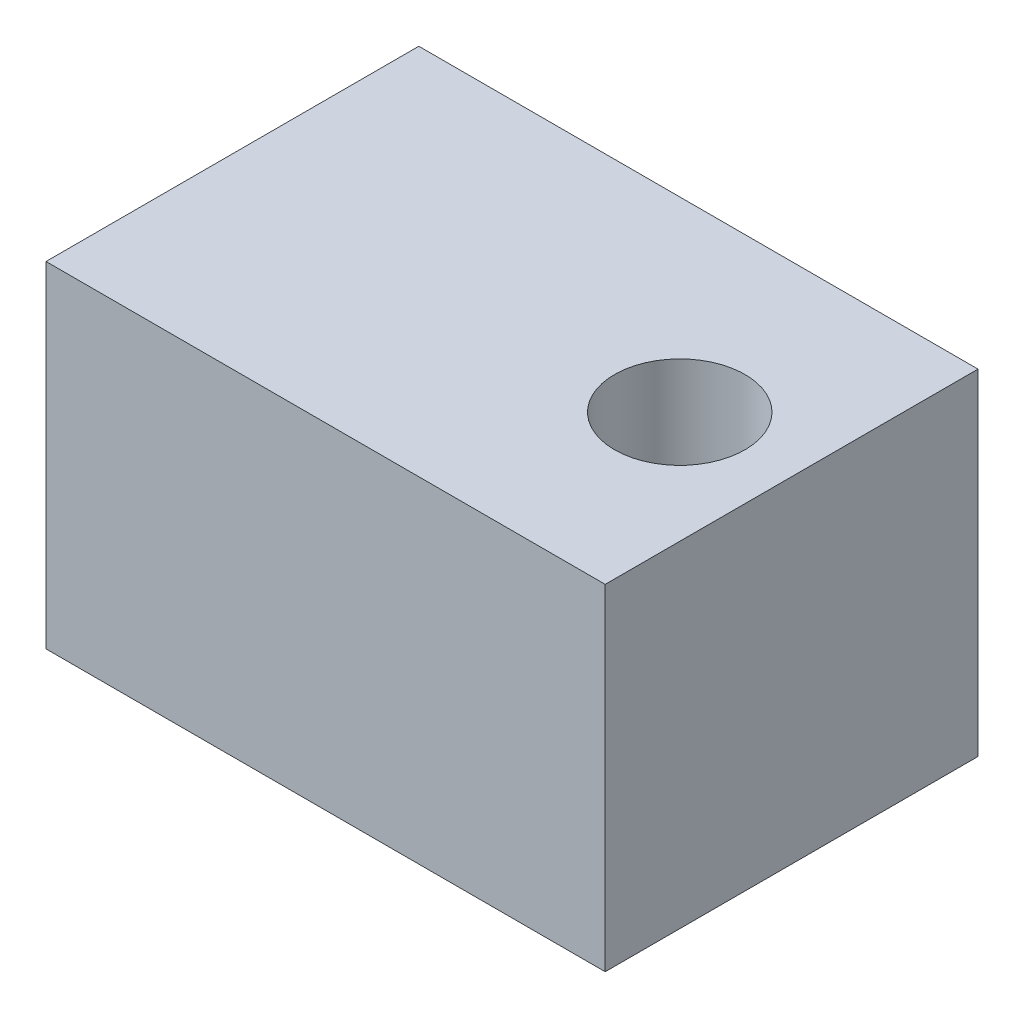
ISO-10303-21;
HEADER;
FILE_DESCRIPTION(('STEP AP214'),'2;1');
FILE_NAME('part.step','',(''),(''),'','','');
FILE_SCHEMA(('AUTOMOTIVE_DESIGN { 1 0 10303 214 1 1 1 1 }'));
ENDSEC;
DATA;
#1=APPLICATION_CONTEXT('core data for automotive mechanical design processes');
#2=APPLICATION_PROTOCOL_DEFINITION('international standard','automotive_design',2000,#1);
#3=PRODUCT_CONTEXT('',#1,'mechanical');
#4=PRODUCT('Part','Part','',(#3));
#5=PRODUCT_RELATED_PRODUCT_CATEGORY('part','',(#4));
#6=PRODUCT_DEFINITION_FORMATION('','',#4);
#7=PRODUCT_DEFINITION_CONTEXT('part definition',#1,'design');
#8=PRODUCT_DEFINITION('design','',#6,#7);
#9=PRODUCT_DEFINITION_SHAPE('','',#8);
#10=(LENGTH_UNIT() NAMED_UNIT(*) SI_UNIT(.MILLI.,.METRE.));
#11=(NAMED_UNIT(*) PLANE_ANGLE_UNIT() SI_UNIT($,.RADIAN.));
#12=(NAMED_UNIT(*) SI_UNIT($,.STERADIAN.) SOLID_ANGLE_UNIT());
#13=UNCERTAINTY_MEASURE_WITH_UNIT(LENGTH_MEASURE(1.E-05),#10,'distance_accuracy_value','');
#14=(GEOMETRIC_REPRESENTATION_CONTEXT(3) GLOBAL_UNCERTAINTY_ASSIGNED_CONTEXT((#13)) GLOBAL_UNIT_ASSIGNED_CONTEXT((#10,
#11,#12)) REPRESENTATION_CONTEXT('',''));
#15=CARTESIAN_POINT('',(0.,0.,0.));
#16=DIRECTION('',(0.,0.,1.));
#17=DIRECTION('',(1.,0.,0.));
#18=AXIS2_PLACEMENT_3D('',#15,#16,#17);
#19=CARTESIAN_POINT('',(7.5,9.,5.));
#20=DIRECTION('',(-1.,0.,0.));
#21=DIRECTION('',(0.,0.,1.));
#22=AXIS2_PLACEMENT_3D('',#19,#20,#21);
#23=PLANE('',#22);
#24=DIRECTION('',(0.,0.,-1.));
#25=VECTOR('',#24,1.);
#26=CARTESIAN_POINT('',(7.5,0.,5.));
#27=LINE('',#26,#25);
#28=CARTESIAN_POINT('',(7.5,0.,5.));
#29=VERTEX_POINT('',#28);
#30=CARTESIAN_POINT('',(7.5,0.,-5.));
#31=VERTEX_POINT('',#30);
#32=EDGE_CURVE('E95',#29,#31,#27,.T.);
#33=ORIENTED_EDGE('',*,*,#32,.T.);
#34=DIRECTION('',(0.,-1.,0.));
#35=VECTOR('',#34,1.);
#36=CARTESIAN_POINT('',(7.5,9.,-5.));
#37=LINE('',#36,#35);
#38=CARTESIAN_POINT('',(7.5,9.,-5.));
#39=VERTEX_POINT('',#38);
#40=EDGE_CURVE('E11',#39,#31,#37,.T.);
#41=ORIENTED_EDGE('',*,*,#40,.F.);
#42=DIRECTION('',(0.,0.,-1.));
#43=VECTOR('',#42,1.);
#44=CARTESIAN_POINT('',(7.5,9.,5.));
#45=LINE('',#44,#43);
#46=CARTESIAN_POINT('',(7.5,9.,5.));
#47=VERTEX_POINT('',#46);
#48=EDGE_CURVE('E83',#47,#39,#45,.T.);
#49=ORIENTED_EDGE('',*,*,#48,.F.);
#50=DIRECTION('',(0.,-1.,0.));
#51=VECTOR('',#50,1.);
#52=CARTESIAN_POINT('',(7.5,9.,5.));
#53=LINE('',#52,#51);
#54=EDGE_CURVE('E91',#47,#29,#53,.T.);
#55=ORIENTED_EDGE('',*,*,#54,.T.);
#56=EDGE_LOOP('',(#33,#41,#49,#55));
#57=FACE_BOUND('',#56,.T.);
#58=ADVANCED_FACE('F32',(#57),#23,.F.);
#59=CARTESIAN_POINT('',(-7.5,9.,-5.));
#60=DIRECTION('',(0.,0.,1.));
#61=DIRECTION('',(1.,0.,0.));
#62=AXIS2_PLACEMENT_3D('',#59,#60,#61);
#63=PLANE('',#62);
#64=DIRECTION('',(-1.,0.,0.));
#65=VECTOR('',#64,1.);
#66=CARTESIAN_POINT('',(-7.5,0.,-5.));
#67=LINE('',#66,#65);
#68=CARTESIAN_POINT('',(-7.5,0.,-5.));
#69=VERTEX_POINT('',#68);
#70=EDGE_CURVE('E87',#31,#69,#67,.T.);
#71=ORIENTED_EDGE('',*,*,#70,.T.);
#72=DIRECTION('',(0.,-1.,0.));
#73=VECTOR('',#72,1.);
#74=CARTESIAN_POINT('',(-7.5,9.,-5.));
#75=LINE('',#74,#73);
#76=CARTESIAN_POINT('',(-7.5,9.,-5.));
#77=VERTEX_POINT('',#76);
#78=EDGE_CURVE('E40',#77,#69,#75,.T.);
#79=ORIENTED_EDGE('',*,*,#78,.F.);
#80=DIRECTION('',(-1.,0.,0.));
#81=VECTOR('',#80,1.);
#82=CARTESIAN_POINT('',(-7.5,9.,-5.));
#83=LINE('',#82,#81);
#84=EDGE_CURVE('E78',#39,#77,#83,.T.);
#85=ORIENTED_EDGE('',*,*,#84,.F.);
#86=ORIENTED_EDGE('',*,*,#40,.T.);
#87=EDGE_LOOP('',(#71,#79,#85,#86));
#88=FACE_BOUND('',#87,.T.);
#89=ADVANCED_FACE('F86',(#88),#63,.F.);
#90=CARTESIAN_POINT('',(-7.5,9.,5.));
#91=DIRECTION('',(1.,0.,0.));
#92=DIRECTION('',(0.,0.,-1.));
#93=AXIS2_PLACEMENT_3D('',#90,#91,#92);
#94=PLANE('',#93);
#95=DIRECTION('',(0.,0.,1.));
#96=VECTOR('',#95,1.);
#97=CARTESIAN_POINT('',(-7.5,0.,5.));
#98=LINE('',#97,#96);
#99=CARTESIAN_POINT('',(-7.5,0.,5.));
#100=VERTEX_POINT('',#99);
#101=EDGE_CURVE('E65',#69,#100,#98,.T.);
#102=ORIENTED_EDGE('',*,*,#101,.T.);
#103=DIRECTION('',(0.,-1.,0.));
#104=VECTOR('',#103,1.);
#105=CARTESIAN_POINT('',(-7.5,9.,5.));
#106=LINE('',#105,#104);
#107=CARTESIAN_POINT('',(-7.5,9.,5.));
#108=VERTEX_POINT('',#107);
#109=EDGE_CURVE('E88',#108,#100,#106,.T.);
#110=ORIENTED_EDGE('',*,*,#109,.F.);
#111=DIRECTION('',(0.,0.,1.));
#112=VECTOR('',#111,1.);
#113=CARTESIAN_POINT('',(-7.5,9.,5.));
#114=LINE('',#113,#112);
#115=EDGE_CURVE('E81',#77,#108,#114,.T.);
#116=ORIENTED_EDGE('',*,*,#115,.F.);
#117=ORIENTED_EDGE('',*,*,#78,.T.);
#118=EDGE_LOOP('',(#102,#110,#116,#117));
#119=FACE_BOUND('',#118,.T.);
#120=ADVANCED_FACE('F89',(#119),#94,.F.);
#121=CARTESIAN_POINT('',(-7.5,9.,5.));
#122=DIRECTION('',(0.,0.,-1.));
#123=DIRECTION('',(-1.,0.,0.));
#124=AXIS2_PLACEMENT_3D('',#121,#122,#123);
#125=PLANE('',#124);
#126=DIRECTION('',(1.,0.,0.));
#127=VECTOR('',#126,1.);
#128=CARTESIAN_POINT('',(-7.5,0.,5.));
#129=LINE('',#128,#127);
#130=EDGE_CURVE('E71',#100,#29,#129,.T.);
#131=ORIENTED_EDGE('',*,*,#130,.T.);
#132=ORIENTED_EDGE('',*,*,#54,.F.);
#133=DIRECTION('',(1.,0.,0.));
#134=VECTOR('',#133,1.);
#135=CARTESIAN_POINT('',(-7.5,9.,5.));
#136=LINE('',#135,#134);
#137=EDGE_CURVE('E48',#108,#47,#136,.T.);
#138=ORIENTED_EDGE('',*,*,#137,.F.);
#139=ORIENTED_EDGE('',*,*,#109,.T.);
#140=EDGE_LOOP('',(#131,#132,#138,#139));
#141=FACE_BOUND('',#140,.T.);
#142=ADVANCED_FACE('F103',(#141),#125,.F.);
#143=CARTESIAN_POINT('',(0.,9.,0.));
#144=DIRECTION('',(0.,-1.,0.));
#145=DIRECTION('',(0.,0.,-1.));
#146=AXIS2_PLACEMENT_3D('',#143,#144,#145);
#147=PLANE('',#146);
#148=CARTESIAN_POINT('',(4.5,9.,0.));
#149=DIRECTION('',(0.,1.,0.));
#150=DIRECTION('',(0.,0.,1.));
#151=AXIS2_PLACEMENT_3D('',#148,#149,#150);
#152=CIRCLE('',#151,1.75);
#153=CARTESIAN_POINT('',(4.5,9.,1.75));
#154=VERTEX_POINT('',#153);
#155=EDGE_CURVE('E109',#154,#154,#152,.T.);
#156=ORIENTED_EDGE('',*,*,#155,.F.);
#157=EDGE_LOOP('',(#156));
#158=FACE_BOUND('',#157,.T.);
#159=ORIENTED_EDGE('',*,*,#48,.T.);
#160=ORIENTED_EDGE('',*,*,#84,.T.);
#161=ORIENTED_EDGE('',*,*,#115,.T.);
#162=ORIENTED_EDGE('',*,*,#137,.T.);
#163=EDGE_LOOP('',(#159,#160,#161,#162));
#164=FACE_BOUND('',#163,.T.);
#165=ADVANCED_FACE('F79',(#158,#164),#147,.F.);
#166=CARTESIAN_POINT('',(0.,0.,0.));
#167=DIRECTION('',(0.,-1.,0.));
#168=DIRECTION('',(0.,0.,-1.));
#169=AXIS2_PLACEMENT_3D('',#166,#167,#168);
#170=PLANE('',#169);
#171=CARTESIAN_POINT('',(4.5,0.,0.));
#172=DIRECTION('',(0.,1.,0.));
#173=DIRECTION('',(0.,0.,1.));
#174=AXIS2_PLACEMENT_3D('',#171,#172,#173);
#175=CIRCLE('',#174,1.75);
#176=CARTESIAN_POINT('',(4.5,0.,1.75));
#177=VERTEX_POINT('',#176);
#178=EDGE_CURVE('E98',#177,#177,#175,.T.);
#179=ORIENTED_EDGE('',*,*,#178,.T.);
#180=EDGE_LOOP('',(#179));
#181=FACE_BOUND('',#180,.T.);
#182=ORIENTED_EDGE('',*,*,#32,.F.);
#183=ORIENTED_EDGE('',*,*,#130,.F.);
#184=ORIENTED_EDGE('',*,*,#101,.F.);
#185=ORIENTED_EDGE('',*,*,#70,.F.);
#186=EDGE_LOOP('',(#182,#183,#184,#185));
#187=FACE_BOUND('',#186,.T.);
#188=ADVANCED_FACE('F106',(#181,#187),#170,.T.);
#189=CARTESIAN_POINT('',(4.5,0.,0.));
#190=DIRECTION('',(0.,1.,0.));
#191=DIRECTION('',(0.,0.,1.));
#192=AXIS2_PLACEMENT_3D('',#189,#190,#191);
#193=CYLINDRICAL_SURFACE('',#192,1.75);
#194=ORIENTED_EDGE('',*,*,#178,.F.);
#195=EDGE_LOOP('',(#194));
#196=FACE_BOUND('',#195,.T.);
#197=ORIENTED_EDGE('',*,*,#155,.T.);
#198=EDGE_LOOP('',(#197));
#199=FACE_BOUND('',#198,.T.);
#200=ADVANCED_FACE('F116',(#196,#199),#193,.F.);
#201=CLOSED_SHELL('',(#58,#89,#120,#142,#165,#188,#200));
#202=MANIFOLD_SOLID_BREP('B2',#201);
#203=ADVANCED_BREP_SHAPE_REPRESENTATION('',(#18,#202),#14);
#204=SHAPE_DEFINITION_REPRESENTATION(#9,#203);
ENDSEC;
END-ISO-10303-21;
